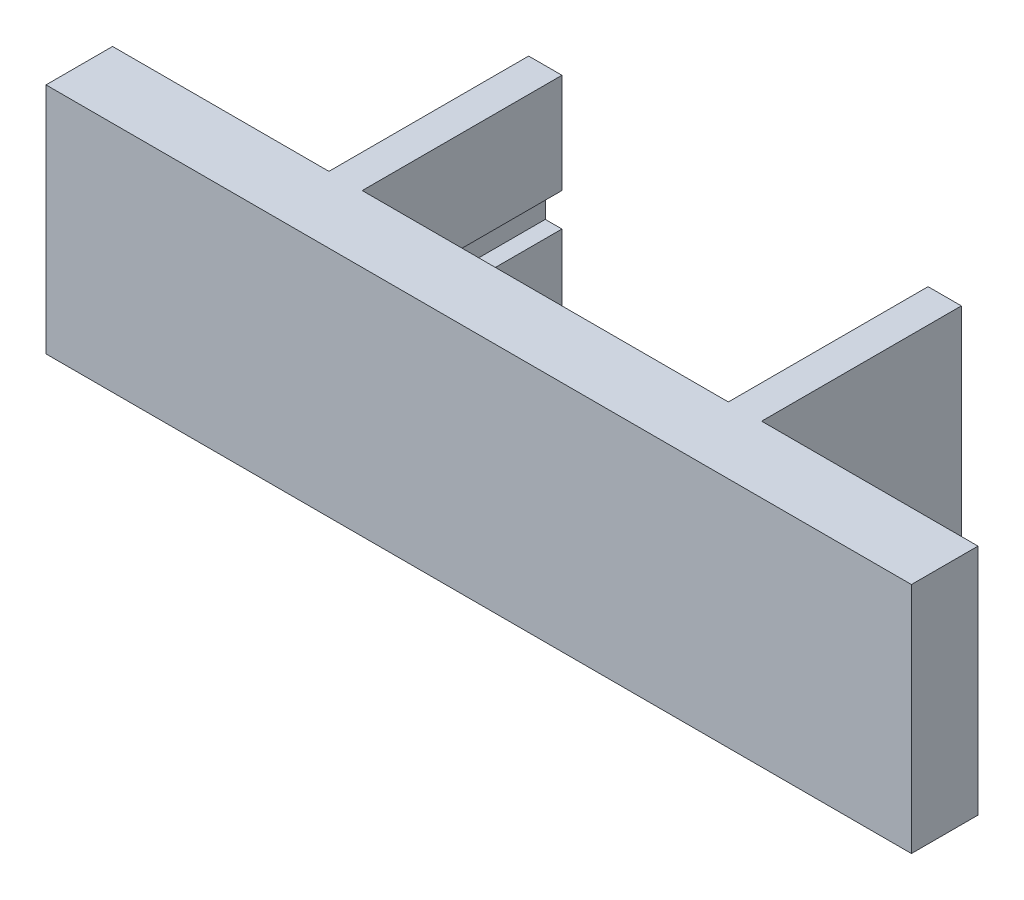
ISO-10303-21;
HEADER;
FILE_DESCRIPTION(('STEP AP214'),'2;1');
FILE_NAME('part.step','',(''),(''),'','','');
FILE_SCHEMA(('AUTOMOTIVE_DESIGN { 1 0 10303 214 1 1 1 1 }'));
ENDSEC;
DATA;
#1=APPLICATION_CONTEXT('core data for automotive mechanical design processes');
#2=APPLICATION_PROTOCOL_DEFINITION('international standard','automotive_design',2000,#1);
#3=PRODUCT_CONTEXT('',#1,'mechanical');
#4=PRODUCT('Part','Part','',(#3));
#5=PRODUCT_RELATED_PRODUCT_CATEGORY('part','',(#4));
#6=PRODUCT_DEFINITION_FORMATION('','',#4);
#7=PRODUCT_DEFINITION_CONTEXT('part definition',#1,'design');
#8=PRODUCT_DEFINITION('design','',#6,#7);
#9=PRODUCT_DEFINITION_SHAPE('','',#8);
#10=(LENGTH_UNIT() NAMED_UNIT(*) SI_UNIT(.MILLI.,.METRE.));
#11=(NAMED_UNIT(*) PLANE_ANGLE_UNIT() SI_UNIT($,.RADIAN.));
#12=(NAMED_UNIT(*) SI_UNIT($,.STERADIAN.) SOLID_ANGLE_UNIT());
#13=UNCERTAINTY_MEASURE_WITH_UNIT(LENGTH_MEASURE(1.E-05),#10,'distance_accuracy_value','');
#14=(GEOMETRIC_REPRESENTATION_CONTEXT(3) GLOBAL_UNCERTAINTY_ASSIGNED_CONTEXT((#13)) GLOBAL_UNIT_ASSIGNED_CONTEXT((#10,
#11,#12)) REPRESENTATION_CONTEXT('',''));
#15=CARTESIAN_POINT('',(0.,0.,0.));
#16=DIRECTION('',(0.,0.,1.));
#17=DIRECTION('',(1.,0.,0.));
#18=AXIS2_PLACEMENT_3D('',#15,#16,#17);
#19=CARTESIAN_POINT('',(0.,0.,0.));
#20=DIRECTION('',(0.,0.,-1.));
#21=DIRECTION('',(-1.,0.,0.));
#22=AXIS2_PLACEMENT_3D('',#19,#20,#21);
#23=PLANE('',#22);
#24=DIRECTION('',(-1.,0.,0.));
#25=VECTOR('',#24,1.);
#26=CARTESIAN_POINT('',(0.,-1.5875,0.));
#27=LINE('',#26,#25);
#28=CARTESIAN_POINT('',(17.4625,-1.5875,0.));
#29=VERTEX_POINT('',#28);
#30=CARTESIAN_POINT('',(-17.4625,-1.5875,0.));
#31=VERTEX_POINT('',#30);
#32=EDGE_CURVE('E218',#29,#31,#27,.T.);
#33=ORIENTED_EDGE('',*,*,#32,.F.);
#34=DIRECTION('',(0.,1.,0.));
#35=VECTOR('',#34,1.);
#36=CARTESIAN_POINT('',(17.4625,0.,0.));
#37=LINE('',#36,#35);
#38=CARTESIAN_POINT('',(17.4625,-11.1125,0.));
#39=VERTEX_POINT('',#38);
#40=EDGE_CURVE('E40',#39,#29,#37,.T.);
#41=ORIENTED_EDGE('',*,*,#40,.F.);
#42=DIRECTION('',(1.,0.,0.));
#43=VECTOR('',#42,1.);
#44=CARTESIAN_POINT('',(-41.275,-11.1125,0.));
#45=LINE('',#44,#43);
#46=CARTESIAN_POINT('',(-17.4625,-11.1125,0.));
#47=VERTEX_POINT('',#46);
#48=EDGE_CURVE('E287',#47,#39,#45,.T.);
#49=ORIENTED_EDGE('',*,*,#48,.F.);
#50=DIRECTION('',(0.,-1.,0.));
#51=VECTOR('',#50,1.);
#52=CARTESIAN_POINT('',(-17.4625,0.,0.));
#53=LINE('',#52,#51);
#54=EDGE_CURVE('E299',#31,#47,#53,.T.);
#55=ORIENTED_EDGE('',*,*,#54,.F.);
#56=EDGE_LOOP('',(#33,#41,#49,#55));
#57=FACE_BOUND('',#56,.T.);
#58=ADVANCED_FACE('F32',(#57),#23,.T.);
#59=CARTESIAN_POINT('',(-17.4625,-36.7101683508479,6.35));
#60=DIRECTION('',(1.,0.,0.));
#61=DIRECTION('',(0.,0.,-1.));
#62=AXIS2_PLACEMENT_3D('',#59,#60,#61);
#63=PLANE('',#62);
#64=DIRECTION('',(0.,0.,-1.));
#65=VECTOR('',#64,1.);
#66=CARTESIAN_POINT('',(-17.4625,-1.5875,6.35));
#67=LINE('',#66,#65);
#68=CARTESIAN_POINT('',(-17.4625,-1.5875,-19.05));
#69=VERTEX_POINT('',#68);
#70=EDGE_CURVE('E220',#31,#69,#67,.T.);
#71=ORIENTED_EDGE('',*,*,#70,.F.);
#72=ORIENTED_EDGE('',*,*,#54,.T.);
#73=DIRECTION('',(0.,0.,1.));
#74=VECTOR('',#73,1.);
#75=CARTESIAN_POINT('',(-17.4625,-11.1125,6.35));
#76=LINE('',#75,#74);
#77=CARTESIAN_POINT('',(-17.4625,-11.1125,-19.05));
#78=VERTEX_POINT('',#77);
#79=EDGE_CURVE('E242',#78,#47,#76,.T.);
#80=ORIENTED_EDGE('',*,*,#79,.F.);
#81=DIRECTION('',(0.,1.,0.));
#82=VECTOR('',#81,1.);
#83=CARTESIAN_POINT('',(-17.4625,-36.7101683508479,-19.05));
#84=LINE('',#83,#82);
#85=EDGE_CURVE('E261',#78,#69,#84,.T.);
#86=ORIENTED_EDGE('',*,*,#85,.T.);
#87=EDGE_LOOP('',(#71,#72,#80,#86));
#88=FACE_BOUND('',#87,.T.);
#89=ADVANCED_FACE('F366',(#88),#63,.T.);
#90=CARTESIAN_POINT('',(17.4625,-36.7101683508479,6.35));
#91=DIRECTION('',(-1.,0.,0.));
#92=DIRECTION('',(0.,0.,1.));
#93=AXIS2_PLACEMENT_3D('',#90,#91,#92);
#94=PLANE('',#93);
#95=DIRECTION('',(0.,0.,1.));
#96=VECTOR('',#95,1.);
#97=CARTESIAN_POINT('',(17.4625,-1.5875,6.35));
#98=LINE('',#97,#96);
#99=CARTESIAN_POINT('',(17.4625,-1.5875,-19.05));
#100=VERTEX_POINT('',#99);
#101=EDGE_CURVE('E216',#100,#29,#98,.T.);
#102=ORIENTED_EDGE('',*,*,#101,.F.);
#103=DIRECTION('',(0.,1.,0.));
#104=VECTOR('',#103,1.);
#105=CARTESIAN_POINT('',(17.4625,-36.7101683508479,-19.05));
#106=LINE('',#105,#104);
#107=CARTESIAN_POINT('',(17.4625,-11.1125,-19.05));
#108=VERTEX_POINT('',#107);
#109=EDGE_CURVE('E226',#108,#100,#106,.T.);
#110=ORIENTED_EDGE('',*,*,#109,.F.);
#111=DIRECTION('',(0.,0.,-1.));
#112=VECTOR('',#111,1.);
#113=CARTESIAN_POINT('',(17.4625,-11.1125,6.35));
#114=LINE('',#113,#112);
#115=EDGE_CURVE('E225',#39,#108,#114,.T.);
#116=ORIENTED_EDGE('',*,*,#115,.F.);
#117=ORIENTED_EDGE('',*,*,#40,.T.);
#118=EDGE_LOOP('',(#102,#110,#116,#117));
#119=FACE_BOUND('',#118,.T.);
#120=ADVANCED_FACE('F355',(#119),#94,.T.);
#121=DIRECTION('',(1.,0.,0.));
#122=VECTOR('',#121,1.);
#123=CARTESIAN_POINT('',(0.,1.5875,0.));
#124=LINE('',#123,#122);
#125=CARTESIAN_POINT('',(-17.4625,1.5875,0.));
#126=VERTEX_POINT('',#125);
#127=CARTESIAN_POINT('',(17.4625,1.5875,0.));
#128=VERTEX_POINT('',#127);
#129=EDGE_CURVE('E212',#126,#128,#124,.T.);
#130=ORIENTED_EDGE('',*,*,#129,.F.);
#131=CARTESIAN_POINT('',(-17.4625,11.1125,0.));
#132=VERTEX_POINT('',#131);
#133=EDGE_CURVE('E300',#132,#126,#53,.T.);
#134=ORIENTED_EDGE('',*,*,#133,.F.);
#135=DIRECTION('',(-1.,0.,0.));
#136=VECTOR('',#135,1.);
#137=CARTESIAN_POINT('',(-41.275,11.1125,0.));
#138=LINE('',#137,#136);
#139=CARTESIAN_POINT('',(17.4625,11.1125,0.));
#140=VERTEX_POINT('',#139);
#141=EDGE_CURVE('E282',#140,#132,#138,.T.);
#142=ORIENTED_EDGE('',*,*,#141,.F.);
#143=EDGE_CURVE('E306',#128,#140,#37,.T.);
#144=ORIENTED_EDGE('',*,*,#143,.F.);
#145=EDGE_LOOP('',(#130,#134,#142,#144));
#146=FACE_BOUND('',#145,.T.);
#147=ADVANCED_FACE('F323',(#146),#23,.T.);
#148=DIRECTION('',(0.,1.,0.));
#149=VECTOR('',#148,1.);
#150=CARTESIAN_POINT('',(-20.6375,0.,0.));
#151=LINE('',#150,#149);
#152=CARTESIAN_POINT('',(-20.6375,-11.1125,0.));
#153=VERTEX_POINT('',#152);
#154=CARTESIAN_POINT('',(-20.6375,11.1125,0.));
#155=VERTEX_POINT('',#154);
#156=EDGE_CURVE('E303',#153,#155,#151,.T.);
#157=ORIENTED_EDGE('',*,*,#156,.F.);
#158=CARTESIAN_POINT('',(-41.275,-11.1125,0.));
#159=VERTEX_POINT('',#158);
#160=EDGE_CURVE('E268',#159,#153,#45,.T.);
#161=ORIENTED_EDGE('',*,*,#160,.F.);
#162=DIRECTION('',(0.,-1.,0.));
#163=VECTOR('',#162,1.);
#164=CARTESIAN_POINT('',(-41.275,-11.1125,0.));
#165=LINE('',#164,#163);
#166=CARTESIAN_POINT('',(-41.275,11.1125,0.));
#167=VERTEX_POINT('',#166);
#168=EDGE_CURVE('E281',#167,#159,#165,.T.);
#169=ORIENTED_EDGE('',*,*,#168,.F.);
#170=EDGE_CURVE('E277',#155,#167,#138,.T.);
#171=ORIENTED_EDGE('',*,*,#170,.F.);
#172=EDGE_LOOP('',(#157,#161,#169,#171));
#173=FACE_BOUND('',#172,.T.);
#174=ADVANCED_FACE('F335',(#173),#23,.T.);
#175=CARTESIAN_POINT('',(41.275,-11.1125,6.35));
#176=DIRECTION('',(-1.,0.,0.));
#177=DIRECTION('',(0.,0.,1.));
#178=AXIS2_PLACEMENT_3D('',#175,#176,#177);
#179=PLANE('',#178);
#180=DIRECTION('',(0.,1.,0.));
#181=VECTOR('',#180,1.);
#182=CARTESIAN_POINT('',(41.275,-11.1125,0.));
#183=LINE('',#182,#181);
#184=CARTESIAN_POINT('',(41.275,-11.1125,0.));
#185=VERTEX_POINT('',#184);
#186=CARTESIAN_POINT('',(41.275,11.1125,0.));
#187=VERTEX_POINT('',#186);
#188=EDGE_CURVE('E250',#185,#187,#183,.T.);
#189=ORIENTED_EDGE('',*,*,#188,.T.);
#190=DIRECTION('',(0.,0.,-1.));
#191=VECTOR('',#190,1.);
#192=CARTESIAN_POINT('',(41.275,11.1125,6.35));
#193=LINE('',#192,#191);
#194=CARTESIAN_POINT('',(41.275,11.1125,6.35));
#195=VERTEX_POINT('',#194);
#196=EDGE_CURVE('E296',#195,#187,#193,.T.);
#197=ORIENTED_EDGE('',*,*,#196,.F.);
#198=DIRECTION('',(0.,1.,0.));
#199=VECTOR('',#198,1.);
#200=CARTESIAN_POINT('',(41.275,-11.1125,6.35));
#201=LINE('',#200,#199);
#202=CARTESIAN_POINT('',(41.275,-11.1125,6.35));
#203=VERTEX_POINT('',#202);
#204=EDGE_CURVE('E264',#203,#195,#201,.T.);
#205=ORIENTED_EDGE('',*,*,#204,.F.);
#206=DIRECTION('',(0.,0.,-1.));
#207=VECTOR('',#206,1.);
#208=CARTESIAN_POINT('',(41.275,-11.1125,6.35));
#209=LINE('',#208,#207);
#210=EDGE_CURVE('E274',#203,#185,#209,.T.);
#211=ORIENTED_EDGE('',*,*,#210,.T.);
#212=EDGE_LOOP('',(#189,#197,#205,#211));
#213=FACE_BOUND('',#212,.T.);
#214=ADVANCED_FACE('F34',(#213),#179,.F.);
#215=CARTESIAN_POINT('',(-41.275,11.1125,6.35));
#216=DIRECTION('',(0.,-1.,0.));
#217=DIRECTION('',(0.,0.,-1.));
#218=AXIS2_PLACEMENT_3D('',#215,#216,#217);
#219=PLANE('',#218);
#220=CARTESIAN_POINT('',(20.6375,11.1125,0.));
#221=VERTEX_POINT('',#220);
#222=EDGE_CURVE('E278',#187,#221,#138,.T.);
#223=ORIENTED_EDGE('',*,*,#222,.T.);
#224=DIRECTION('',(0.,0.,-1.));
#225=VECTOR('',#224,1.);
#226=CARTESIAN_POINT('',(20.6375,11.1125,6.35));
#227=LINE('',#226,#225);
#228=CARTESIAN_POINT('',(20.6375,11.1125,-19.05));
#229=VERTEX_POINT('',#228);
#230=EDGE_CURVE('E222',#221,#229,#227,.T.);
#231=ORIENTED_EDGE('',*,*,#230,.T.);
#232=DIRECTION('',(-1.,0.,0.));
#233=VECTOR('',#232,1.);
#234=CARTESIAN_POINT('',(20.6375,11.1125,-19.05));
#235=LINE('',#234,#233);
#236=CARTESIAN_POINT('',(17.4625,11.1125,-19.05));
#237=VERTEX_POINT('',#236);
#238=EDGE_CURVE('E229',#229,#237,#235,.T.);
#239=ORIENTED_EDGE('',*,*,#238,.T.);
#240=DIRECTION('',(0.,0.,1.));
#241=VECTOR('',#240,1.);
#242=CARTESIAN_POINT('',(17.4625,11.1125,6.35));
#243=LINE('',#242,#241);
#244=EDGE_CURVE('E232',#237,#140,#243,.T.);
#245=ORIENTED_EDGE('',*,*,#244,.T.);
#246=ORIENTED_EDGE('',*,*,#141,.T.);
#247=DIRECTION('',(0.,0.,-1.));
#248=VECTOR('',#247,1.);
#249=CARTESIAN_POINT('',(-17.4625,11.1125,6.35));
#250=LINE('',#249,#248);
#251=CARTESIAN_POINT('',(-17.4625,11.1125,-19.05));
#252=VERTEX_POINT('',#251);
#253=EDGE_CURVE('E253',#132,#252,#250,.T.);
#254=ORIENTED_EDGE('',*,*,#253,.T.);
#255=DIRECTION('',(-1.,0.,0.));
#256=VECTOR('',#255,1.);
#257=CARTESIAN_POINT('',(-20.6375,11.1125,-19.05));
#258=LINE('',#257,#256);
#259=CARTESIAN_POINT('',(-20.6375,11.1125,-19.05));
#260=VERTEX_POINT('',#259);
#261=EDGE_CURVE('E256',#252,#260,#258,.T.);
#262=ORIENTED_EDGE('',*,*,#261,.T.);
#263=DIRECTION('',(0.,0.,1.));
#264=VECTOR('',#263,1.);
#265=CARTESIAN_POINT('',(-20.6375,11.1125,6.35));
#266=LINE('',#265,#264);
#267=EDGE_CURVE('E241',#260,#155,#266,.T.);
#268=ORIENTED_EDGE('',*,*,#267,.T.);
#269=ORIENTED_EDGE('',*,*,#170,.T.);
#270=DIRECTION('',(0.,0.,-1.));
#271=VECTOR('',#270,1.);
#272=CARTESIAN_POINT('',(-41.275,11.1125,6.35));
#273=LINE('',#272,#271);
#274=CARTESIAN_POINT('',(-41.275,11.1125,6.35));
#275=VERTEX_POINT('',#274);
#276=EDGE_CURVE('E293',#275,#167,#273,.T.);
#277=ORIENTED_EDGE('',*,*,#276,.F.);
#278=DIRECTION('',(-1.,0.,0.));
#279=VECTOR('',#278,1.);
#280=CARTESIAN_POINT('',(-41.275,11.1125,6.35));
#281=LINE('',#280,#279);
#282=EDGE_CURVE('E267',#195,#275,#281,.T.);
#283=ORIENTED_EDGE('',*,*,#282,.F.);
#284=ORIENTED_EDGE('',*,*,#196,.T.);
#285=EDGE_LOOP('',(#223,#231,#239,#245,#246,#254,#262,#268,#269,#277,#283,#284));
#286=FACE_BOUND('',#285,.T.);
#287=ADVANCED_FACE('F319',(#286),#219,.F.);
#288=CARTESIAN_POINT('',(-41.275,-11.1125,6.35));
#289=DIRECTION('',(1.,0.,0.));
#290=DIRECTION('',(0.,0.,-1.));
#291=AXIS2_PLACEMENT_3D('',#288,#289,#290);
#292=PLANE('',#291);
#293=ORIENTED_EDGE('',*,*,#168,.T.);
#294=DIRECTION('',(0.,0.,-1.));
#295=VECTOR('',#294,1.);
#296=CARTESIAN_POINT('',(-41.275,-11.1125,6.35));
#297=LINE('',#296,#295);
#298=CARTESIAN_POINT('',(-41.275,-11.1125,6.35));
#299=VERTEX_POINT('',#298);
#300=EDGE_CURVE('E290',#299,#159,#297,.T.);
#301=ORIENTED_EDGE('',*,*,#300,.F.);
#302=DIRECTION('',(0.,-1.,0.));
#303=VECTOR('',#302,1.);
#304=CARTESIAN_POINT('',(-41.275,-11.1125,6.35));
#305=LINE('',#304,#303);
#306=EDGE_CURVE('E270',#275,#299,#305,.T.);
#307=ORIENTED_EDGE('',*,*,#306,.F.);
#308=ORIENTED_EDGE('',*,*,#276,.T.);
#309=EDGE_LOOP('',(#293,#301,#307,#308));
#310=FACE_BOUND('',#309,.T.);
#311=ADVANCED_FACE('F332',(#310),#292,.F.);
#312=CARTESIAN_POINT('',(-41.275,-11.1125,6.35));
#313=DIRECTION('',(0.,1.,0.));
#314=DIRECTION('',(0.,0.,1.));
#315=AXIS2_PLACEMENT_3D('',#312,#313,#314);
#316=PLANE('',#315);
#317=ORIENTED_EDGE('',*,*,#210,.F.);
#318=DIRECTION('',(1.,0.,0.));
#319=VECTOR('',#318,1.);
#320=CARTESIAN_POINT('',(-41.275,-11.1125,6.35));
#321=LINE('',#320,#319);
#322=EDGE_CURVE('E272',#299,#203,#321,.T.);
#323=ORIENTED_EDGE('',*,*,#322,.F.);
#324=ORIENTED_EDGE('',*,*,#300,.T.);
#325=ORIENTED_EDGE('',*,*,#160,.T.);
#326=DIRECTION('',(0.,0.,-1.));
#327=VECTOR('',#326,1.);
#328=CARTESIAN_POINT('',(-20.6375,-11.1125,6.35));
#329=LINE('',#328,#327);
#330=CARTESIAN_POINT('',(-20.6375,-11.1125,-19.05));
#331=VERTEX_POINT('',#330);
#332=EDGE_CURVE('E248',#153,#331,#329,.T.);
#333=ORIENTED_EDGE('',*,*,#332,.T.);
#334=DIRECTION('',(1.,0.,0.));
#335=VECTOR('',#334,1.);
#336=CARTESIAN_POINT('',(-20.6375,-11.1125,-19.05));
#337=LINE('',#336,#335);
#338=EDGE_CURVE('E245',#331,#78,#337,.T.);
#339=ORIENTED_EDGE('',*,*,#338,.T.);
#340=ORIENTED_EDGE('',*,*,#79,.T.);
#341=ORIENTED_EDGE('',*,*,#48,.T.);
#342=ORIENTED_EDGE('',*,*,#115,.T.);
#343=DIRECTION('',(1.,0.,0.));
#344=VECTOR('',#343,1.);
#345=CARTESIAN_POINT('',(20.6375,-11.1125,-19.05));
#346=LINE('',#345,#344);
#347=CARTESIAN_POINT('',(20.6375,-11.1125,-19.05));
#348=VERTEX_POINT('',#347);
#349=EDGE_CURVE('E223',#108,#348,#346,.T.);
#350=ORIENTED_EDGE('',*,*,#349,.T.);
#351=DIRECTION('',(0.,0.,1.));
#352=VECTOR('',#351,1.);
#353=CARTESIAN_POINT('',(20.6375,-11.1125,6.35));
#354=LINE('',#353,#352);
#355=CARTESIAN_POINT('',(20.6375,-11.1125,0.));
#356=VERTEX_POINT('',#355);
#357=EDGE_CURVE('E55',#348,#356,#354,.T.);
#358=ORIENTED_EDGE('',*,*,#357,.T.);
#359=EDGE_CURVE('E284',#356,#185,#45,.T.);
#360=ORIENTED_EDGE('',*,*,#359,.T.);
#361=EDGE_LOOP('',(#317,#323,#324,#325,#333,#339,#340,#341,#342,#350,#358,#360));
#362=FACE_BOUND('',#361,.T.);
#363=ADVANCED_FACE('F337',(#362),#316,.F.);
#364=CARTESIAN_POINT('',(0.,0.,6.35));
#365=DIRECTION('',(0.,0.,-1.));
#366=DIRECTION('',(-1.,0.,0.));
#367=AXIS2_PLACEMENT_3D('',#364,#365,#366);
#368=PLANE('',#367);
#369=ORIENTED_EDGE('',*,*,#282,.T.);
#370=ORIENTED_EDGE('',*,*,#306,.T.);
#371=ORIENTED_EDGE('',*,*,#322,.T.);
#372=ORIENTED_EDGE('',*,*,#204,.T.);
#373=EDGE_LOOP('',(#369,#370,#371,#372));
#374=FACE_BOUND('',#373,.T.);
#375=ADVANCED_FACE('F342',(#374),#368,.F.);
#376=DIRECTION('',(0.,-1.,0.));
#377=VECTOR('',#376,1.);
#378=CARTESIAN_POINT('',(20.6375,0.,0.));
#379=LINE('',#378,#377);
#380=EDGE_CURVE('E305',#221,#356,#379,.T.);
#381=ORIENTED_EDGE('',*,*,#380,.F.);
#382=ORIENTED_EDGE('',*,*,#222,.F.);
#383=ORIENTED_EDGE('',*,*,#188,.F.);
#384=ORIENTED_EDGE('',*,*,#359,.F.);
#385=EDGE_LOOP('',(#381,#382,#383,#384));
#386=FACE_BOUND('',#385,.T.);
#387=ADVANCED_FACE('F349',(#386),#23,.T.);
#388=CARTESIAN_POINT('',(-20.6375,-36.7101683508479,6.35));
#389=DIRECTION('',(-1.,0.,0.));
#390=DIRECTION('',(0.,0.,1.));
#391=AXIS2_PLACEMENT_3D('',#388,#389,#390);
#392=PLANE('',#391);
#393=ORIENTED_EDGE('',*,*,#332,.F.);
#394=ORIENTED_EDGE('',*,*,#156,.T.);
#395=ORIENTED_EDGE('',*,*,#267,.F.);
#396=DIRECTION('',(0.,1.,0.));
#397=VECTOR('',#396,1.);
#398=CARTESIAN_POINT('',(-20.6375,-36.7101683508479,-19.05));
#399=LINE('',#398,#397);
#400=EDGE_CURVE('E246',#331,#260,#399,.T.);
#401=ORIENTED_EDGE('',*,*,#400,.F.);
#402=EDGE_LOOP('',(#393,#394,#395,#401));
#403=FACE_BOUND('',#402,.T.);
#404=ADVANCED_FACE('F373',(#403),#392,.T.);
#405=CARTESIAN_POINT('',(-20.6375,-36.7101683508479,-19.05));
#406=DIRECTION('',(0.,0.,-1.));
#407=DIRECTION('',(-1.,0.,0.));
#408=AXIS2_PLACEMENT_3D('',#405,#406,#407);
#409=PLANE('',#408);
#410=DIRECTION('',(1.,0.,0.));
#411=VECTOR('',#410,1.);
#412=CARTESIAN_POINT('',(-19.05,-1.5875,-19.05));
#413=LINE('',#412,#411);
#414=CARTESIAN_POINT('',(-19.05,-1.5875,-19.05));
#415=VERTEX_POINT('',#414);
#416=EDGE_CURVE('E179',#415,#69,#413,.T.);
#417=ORIENTED_EDGE('',*,*,#416,.T.);
#418=ORIENTED_EDGE('',*,*,#85,.F.);
#419=ORIENTED_EDGE('',*,*,#338,.F.);
#420=ORIENTED_EDGE('',*,*,#400,.T.);
#421=ORIENTED_EDGE('',*,*,#261,.F.);
#422=CARTESIAN_POINT('',(-17.4625,1.5875,-19.05));
#423=VERTEX_POINT('',#422);
#424=EDGE_CURVE('E259',#423,#252,#84,.T.);
#425=ORIENTED_EDGE('',*,*,#424,.F.);
#426=DIRECTION('',(-1.,0.,0.));
#427=VECTOR('',#426,1.);
#428=CARTESIAN_POINT('',(-19.05,1.5875,-19.05));
#429=LINE('',#428,#427);
#430=CARTESIAN_POINT('',(-19.05,1.5875,-19.05));
#431=VERTEX_POINT('',#430);
#432=EDGE_CURVE('E186',#423,#431,#429,.T.);
#433=ORIENTED_EDGE('',*,*,#432,.T.);
#434=DIRECTION('',(0.,-1.,0.));
#435=VECTOR('',#434,1.);
#436=CARTESIAN_POINT('',(-19.05,-1.5875,-19.05));
#437=LINE('',#436,#435);
#438=EDGE_CURVE('E185',#431,#415,#437,.T.);
#439=ORIENTED_EDGE('',*,*,#438,.T.);
#440=EDGE_LOOP('',(#417,#418,#419,#420,#421,#425,#433,#439));
#441=FACE_BOUND('',#440,.T.);
#442=ADVANCED_FACE('F370',(#441),#409,.T.);
#443=DIRECTION('',(0.,0.,1.));
#444=VECTOR('',#443,1.);
#445=CARTESIAN_POINT('',(-17.4625,1.5875,6.35));
#446=LINE('',#445,#444);
#447=EDGE_CURVE('E214',#423,#126,#446,.T.);
#448=ORIENTED_EDGE('',*,*,#447,.F.);
#449=ORIENTED_EDGE('',*,*,#424,.T.);
#450=ORIENTED_EDGE('',*,*,#253,.F.);
#451=ORIENTED_EDGE('',*,*,#133,.T.);
#452=EDGE_LOOP('',(#448,#449,#450,#451));
#453=FACE_BOUND('',#452,.T.);
#454=ADVANCED_FACE('F377',(#453),#63,.T.);
#455=DIRECTION('',(0.,0.,-1.));
#456=VECTOR('',#455,1.);
#457=CARTESIAN_POINT('',(17.4625,1.5875,6.35));
#458=LINE('',#457,#456);
#459=CARTESIAN_POINT('',(17.4625,1.5875,-19.05));
#460=VERTEX_POINT('',#459);
#461=EDGE_CURVE('E47',#128,#460,#458,.T.);
#462=ORIENTED_EDGE('',*,*,#461,.F.);
#463=ORIENTED_EDGE('',*,*,#143,.T.);
#464=ORIENTED_EDGE('',*,*,#244,.F.);
#465=EDGE_CURVE('E237',#460,#237,#106,.T.);
#466=ORIENTED_EDGE('',*,*,#465,.F.);
#467=EDGE_LOOP('',(#462,#463,#464,#466));
#468=FACE_BOUND('',#467,.T.);
#469=ADVANCED_FACE('F314',(#468),#94,.T.);
#470=CARTESIAN_POINT('',(20.6375,-36.7101683508479,-19.05));
#471=DIRECTION('',(0.,0.,-1.));
#472=DIRECTION('',(-1.,0.,0.));
#473=AXIS2_PLACEMENT_3D('',#470,#471,#472);
#474=PLANE('',#473);
#475=DIRECTION('',(-1.,0.,0.));
#476=VECTOR('',#475,1.);
#477=CARTESIAN_POINT('',(20.6375,-1.5875,-19.05));
#478=LINE('',#477,#476);
#479=CARTESIAN_POINT('',(19.05,-1.5875,-19.05));
#480=VERTEX_POINT('',#479);
#481=EDGE_CURVE('E11',#480,#100,#478,.T.);
#482=ORIENTED_EDGE('',*,*,#481,.F.);
#483=DIRECTION('',(0.,1.,0.));
#484=VECTOR('',#483,1.);
#485=CARTESIAN_POINT('',(19.05,-1.5875,-19.05));
#486=LINE('',#485,#484);
#487=CARTESIAN_POINT('',(19.05,1.5875,-19.05));
#488=VERTEX_POINT('',#487);
#489=EDGE_CURVE('E172',#480,#488,#486,.T.);
#490=ORIENTED_EDGE('',*,*,#489,.T.);
#491=EDGE_CURVE('E181',#488,#460,#429,.T.);
#492=ORIENTED_EDGE('',*,*,#491,.T.);
#493=ORIENTED_EDGE('',*,*,#465,.T.);
#494=ORIENTED_EDGE('',*,*,#238,.F.);
#495=DIRECTION('',(0.,1.,0.));
#496=VECTOR('',#495,1.);
#497=CARTESIAN_POINT('',(20.6375,-36.7101683508479,-19.05));
#498=LINE('',#497,#496);
#499=EDGE_CURVE('E235',#348,#229,#498,.T.);
#500=ORIENTED_EDGE('',*,*,#499,.F.);
#501=ORIENTED_EDGE('',*,*,#349,.F.);
#502=ORIENTED_EDGE('',*,*,#109,.T.);
#503=EDGE_LOOP('',(#482,#490,#492,#493,#494,#500,#501,#502));
#504=FACE_BOUND('',#503,.T.);
#505=ADVANCED_FACE('F188',(#504),#474,.T.);
#506=CARTESIAN_POINT('',(20.6375,-36.7101683508479,6.35));
#507=DIRECTION('',(1.,0.,0.));
#508=DIRECTION('',(0.,0.,-1.));
#509=AXIS2_PLACEMENT_3D('',#506,#507,#508);
#510=PLANE('',#509);
#511=ORIENTED_EDGE('',*,*,#230,.F.);
#512=ORIENTED_EDGE('',*,*,#380,.T.);
#513=ORIENTED_EDGE('',*,*,#357,.F.);
#514=ORIENTED_EDGE('',*,*,#499,.T.);
#515=EDGE_LOOP('',(#511,#512,#513,#514));
#516=FACE_BOUND('',#515,.T.);
#517=ADVANCED_FACE('F351',(#516),#510,.T.);
#518=CARTESIAN_POINT('',(19.05,-1.5875,-19.05));
#519=DIRECTION('',(1.,0.,0.));
#520=DIRECTION('',(0.,0.,-1.));
#521=AXIS2_PLACEMENT_3D('',#518,#519,#520);
#522=PLANE('',#521);
#523=DIRECTION('',(0.,1.,0.));
#524=VECTOR('',#523,1.);
#525=CARTESIAN_POINT('',(19.05,-1.5875,3.175));
#526=LINE('',#525,#524);
#527=CARTESIAN_POINT('',(19.05,-1.5875,3.175));
#528=VERTEX_POINT('',#527);
#529=CARTESIAN_POINT('',(19.05,1.5875,3.175));
#530=VERTEX_POINT('',#529);
#531=EDGE_CURVE('E175',#528,#530,#526,.T.);
#532=ORIENTED_EDGE('',*,*,#531,.T.);
#533=DIRECTION('',(0.,0.,1.));
#534=VECTOR('',#533,1.);
#535=CARTESIAN_POINT('',(19.05,1.5875,-19.05));
#536=LINE('',#535,#534);
#537=EDGE_CURVE('E169',#488,#530,#536,.T.);
#538=ORIENTED_EDGE('',*,*,#537,.F.);
#539=ORIENTED_EDGE('',*,*,#489,.F.);
#540=DIRECTION('',(0.,0.,1.));
#541=VECTOR('',#540,1.);
#542=CARTESIAN_POINT('',(19.05,-1.5875,-19.05));
#543=LINE('',#542,#541);
#544=EDGE_CURVE('E206',#480,#528,#543,.T.);
#545=ORIENTED_EDGE('',*,*,#544,.T.);
#546=EDGE_LOOP('',(#532,#538,#539,#545));
#547=FACE_BOUND('',#546,.T.);
#548=ADVANCED_FACE('F170',(#547),#522,.F.);
#549=CARTESIAN_POINT('',(-19.05,-1.5875,-19.05));
#550=DIRECTION('',(0.,-1.,0.));
#551=DIRECTION('',(0.,0.,-1.));
#552=AXIS2_PLACEMENT_3D('',#549,#550,#551);
#553=PLANE('',#552);
#554=ORIENTED_EDGE('',*,*,#70,.T.);
#555=ORIENTED_EDGE('',*,*,#416,.F.);
#556=DIRECTION('',(0.,0.,1.));
#557=VECTOR('',#556,1.);
#558=CARTESIAN_POINT('',(-19.05,-1.5875,-19.05));
#559=LINE('',#558,#557);
#560=CARTESIAN_POINT('',(-19.05,-1.5875,3.175));
#561=VERTEX_POINT('',#560);
#562=EDGE_CURVE('E208',#415,#561,#559,.T.);
#563=ORIENTED_EDGE('',*,*,#562,.T.);
#564=DIRECTION('',(1.,0.,0.));
#565=VECTOR('',#564,1.);
#566=CARTESIAN_POINT('',(-19.05,-1.5875,3.175));
#567=LINE('',#566,#565);
#568=EDGE_CURVE('E190',#561,#528,#567,.T.);
#569=ORIENTED_EDGE('',*,*,#568,.T.);
#570=ORIENTED_EDGE('',*,*,#544,.F.);
#571=ORIENTED_EDGE('',*,*,#481,.T.);
#572=ORIENTED_EDGE('',*,*,#101,.T.);
#573=ORIENTED_EDGE('',*,*,#32,.T.);
#574=EDGE_LOOP('',(#554,#555,#563,#569,#570,#571,#572,#573));
#575=FACE_BOUND('',#574,.T.);
#576=ADVANCED_FACE('F358',(#575),#553,.F.);
#577=CARTESIAN_POINT('',(-19.05,-1.5875,-19.05));
#578=DIRECTION('',(-1.,0.,0.));
#579=DIRECTION('',(0.,0.,1.));
#580=AXIS2_PLACEMENT_3D('',#577,#578,#579);
#581=PLANE('',#580);
#582=DIRECTION('',(0.,-1.,0.));
#583=VECTOR('',#582,1.);
#584=CARTESIAN_POINT('',(-19.05,-1.5875,3.175));
#585=LINE('',#584,#583);
#586=CARTESIAN_POINT('',(-19.05,1.5875,3.175));
#587=VERTEX_POINT('',#586);
#588=EDGE_CURVE('E194',#587,#561,#585,.T.);
#589=ORIENTED_EDGE('',*,*,#588,.T.);
#590=ORIENTED_EDGE('',*,*,#562,.F.);
#591=ORIENTED_EDGE('',*,*,#438,.F.);
#592=DIRECTION('',(0.,0.,1.));
#593=VECTOR('',#592,1.);
#594=CARTESIAN_POINT('',(-19.05,1.5875,-19.05));
#595=LINE('',#594,#593);
#596=EDGE_CURVE('E178',#431,#587,#595,.T.);
#597=ORIENTED_EDGE('',*,*,#596,.T.);
#598=EDGE_LOOP('',(#589,#590,#591,#597));
#599=FACE_BOUND('',#598,.T.);
#600=ADVANCED_FACE('F381',(#599),#581,.F.);
#601=CARTESIAN_POINT('',(-19.05,1.5875,-19.05));
#602=DIRECTION('',(0.,1.,0.));
#603=DIRECTION('',(0.,0.,1.));
#604=AXIS2_PLACEMENT_3D('',#601,#602,#603);
#605=PLANE('',#604);
#606=ORIENTED_EDGE('',*,*,#447,.T.);
#607=ORIENTED_EDGE('',*,*,#129,.T.);
#608=ORIENTED_EDGE('',*,*,#461,.T.);
#609=ORIENTED_EDGE('',*,*,#491,.F.);
#610=ORIENTED_EDGE('',*,*,#537,.T.);
#611=DIRECTION('',(-1.,0.,0.));
#612=VECTOR('',#611,1.);
#613=CARTESIAN_POINT('',(-19.05,1.5875,3.175));
#614=LINE('',#613,#612);
#615=EDGE_CURVE('E202',#530,#587,#614,.T.);
#616=ORIENTED_EDGE('',*,*,#615,.T.);
#617=ORIENTED_EDGE('',*,*,#596,.F.);
#618=ORIENTED_EDGE('',*,*,#432,.F.);
#619=EDGE_LOOP('',(#606,#607,#608,#609,#610,#616,#617,#618));
#620=FACE_BOUND('',#619,.T.);
#621=ADVANCED_FACE('F182',(#620),#605,.F.);
#622=CARTESIAN_POINT('',(0.,0.,3.175));
#623=DIRECTION('',(0.,0.,-1.));
#624=DIRECTION('',(-1.,0.,0.));
#625=AXIS2_PLACEMENT_3D('',#622,#623,#624);
#626=PLANE('',#625);
#627=ORIENTED_EDGE('',*,*,#531,.F.);
#628=ORIENTED_EDGE('',*,*,#568,.F.);
#629=ORIENTED_EDGE('',*,*,#588,.F.);
#630=ORIENTED_EDGE('',*,*,#615,.F.);
#631=EDGE_LOOP('',(#627,#628,#629,#630));
#632=FACE_BOUND('',#631,.T.);
#633=ADVANCED_FACE('F385',(#632),#626,.T.);
#634=CLOSED_SHELL('',(#58,#89,#120,#147,#174,#214,#287,#311,#363,#375,#387,#404,#442,#454,#469,
#505,#517,#548,#576,#600,#621,#633));
#635=MANIFOLD_SOLID_BREP('B2',#634);
#636=ADVANCED_BREP_SHAPE_REPRESENTATION('',(#18,#635),#14);
#637=SHAPE_DEFINITION_REPRESENTATION(#9,#636);
ENDSEC;
END-ISO-10303-21;
